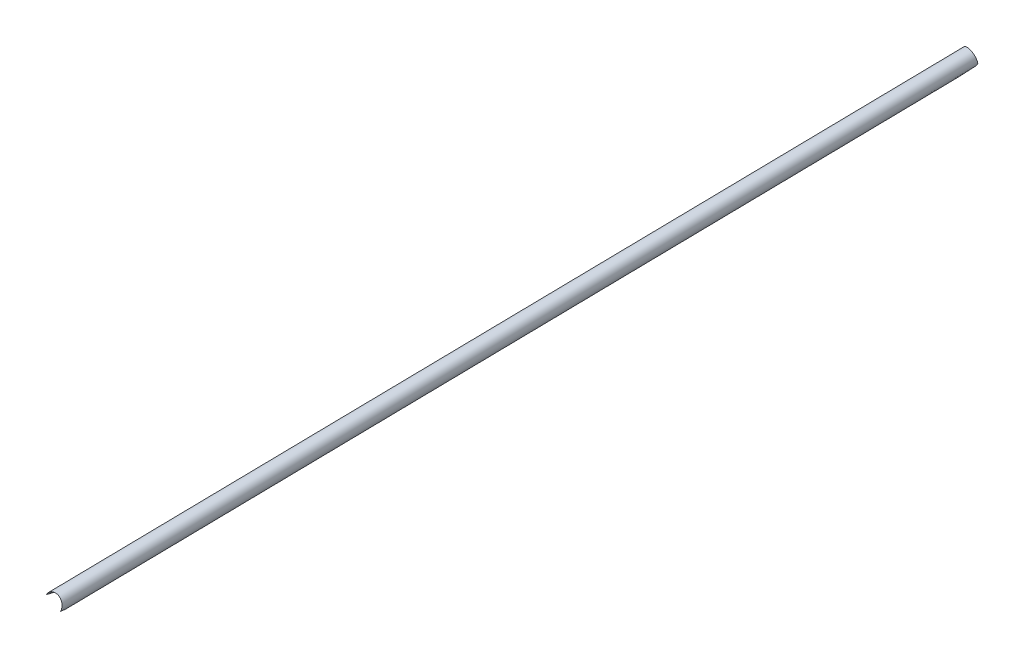
ISO-10303-21;
HEADER;
FILE_DESCRIPTION(('STEP AP214'),'2;1');
FILE_NAME('part.step','',(''),(''),'','','');
FILE_SCHEMA(('AUTOMOTIVE_DESIGN { 1 0 10303 214 1 1 1 1 }'));
ENDSEC;
DATA;
#1=APPLICATION_CONTEXT('core data for automotive mechanical design processes');
#2=APPLICATION_PROTOCOL_DEFINITION('international standard','automotive_design',2000,#1);
#3=PRODUCT_CONTEXT('',#1,'mechanical');
#4=PRODUCT('Part','Part','',(#3));
#5=PRODUCT_RELATED_PRODUCT_CATEGORY('part','',(#4));
#6=PRODUCT_DEFINITION_FORMATION('','',#4);
#7=PRODUCT_DEFINITION_CONTEXT('part definition',#1,'design');
#8=PRODUCT_DEFINITION('design','',#6,#7);
#9=PRODUCT_DEFINITION_SHAPE('','',#8);
#10=(LENGTH_UNIT() NAMED_UNIT(*) SI_UNIT(.MILLI.,.METRE.));
#11=(NAMED_UNIT(*) PLANE_ANGLE_UNIT() SI_UNIT($,.RADIAN.));
#12=(NAMED_UNIT(*) SI_UNIT($,.STERADIAN.) SOLID_ANGLE_UNIT());
#13=UNCERTAINTY_MEASURE_WITH_UNIT(LENGTH_MEASURE(1.E-05),#10,'distance_accuracy_value','');
#14=(GEOMETRIC_REPRESENTATION_CONTEXT(3) GLOBAL_UNCERTAINTY_ASSIGNED_CONTEXT((#13)) GLOBAL_UNIT_ASSIGNED_CONTEXT((#10,
#11,#12)) REPRESENTATION_CONTEXT('',''));
#15=CARTESIAN_POINT('',(0.,0.,0.));
#16=DIRECTION('',(0.,0.,1.));
#17=DIRECTION('',(1.,0.,0.));
#18=AXIS2_PLACEMENT_3D('',#15,#16,#17);
#19=CARTESIAN_POINT('',(325.000000000001,320.,-1580.));
#20=DIRECTION('',(-0.0876619818920292,-0.105194378270435,0.99058039537993));
#21=DIRECTION('',(0.,-0.994408591727349,-0.105600912395825));
#22=AXIS2_PLACEMENT_3D('',#19,#20,#21);
#23=CYLINDRICAL_SURFACE('',#22,9.39999999999998);
#24=CARTESIAN_POINT('',(227.490731729438,193.641437313088,-479.137917119167));
#25=CARTESIAN_POINT('',(227.640293598712,193.620829887061,-478.943880453466));
#26=CARTESIAN_POINT('',(227.784230749418,193.604130606577,-478.745098924725));
#27=CARTESIAN_POINT('',(228.062362185384,193.577332069171,-478.340354423965));
#28=CARTESIAN_POINT('',(228.196552315665,193.567235612407,-478.13438844408));
#29=CARTESIAN_POINT('',(228.45656927496,193.55271356251,-477.716653854516));
#30=CARTESIAN_POINT('',(228.582383440522,193.548296379059,-477.504877112932));
#31=CARTESIAN_POINT('',(228.826476328883,193.544437737184,-477.076974424028));
#32=CARTESIAN_POINT('',(228.944754240573,193.544996813437,-476.860848011845));
#33=CARTESIAN_POINT('',(229.175366406883,193.550546205979,-476.423720790084));
#34=CARTESIAN_POINT('',(229.287657087848,193.555565267787,-476.202697444109));
#35=CARTESIAN_POINT('',(229.506182945142,193.569627597137,-475.757813133367));
#36=CARTESIAN_POINT('',(229.612417984254,193.578670955826,-475.53395210444));
#37=CARTESIAN_POINT('',(229.922783087401,193.61126808132,-474.859332415869));
#38=CARTESIAN_POINT('',(230.118803467549,193.640296063772,-474.405093308473));
#39=CARTESIAN_POINT('',(230.507383267334,193.713679891219,-473.45515499325));
#40=CARTESIAN_POINT('',(230.698513476557,193.759044039791,-472.958956974658));
#41=CARTESIAN_POINT('',(231.063543315764,193.863004828068,-471.961557268425));
#42=CARTESIAN_POINT('',(231.237439350937,193.921604220139,-471.460354560773));
#43=CARTESIAN_POINT('',(231.570813086138,194.051506023565,-470.453979654734));
#44=CARTESIAN_POINT('',(231.730268433771,194.122827637244,-469.948802575015));
#45=CARTESIAN_POINT('',(232.03650398143,194.278156563566,-468.936629673633));
#46=CARTESIAN_POINT('',(232.183285430552,194.362162623826,-468.429634036342));
#47=CARTESIAN_POINT('',(232.465341465405,194.543264378551,-467.416886323554));
#48=CARTESIAN_POINT('',(232.600657075127,194.640309888123,-466.911136698944));
#49=CARTESIAN_POINT('',(232.861816791936,194.849295824819,-465.900183099332));
#50=CARTESIAN_POINT('',(232.987659508985,194.961238431278,-465.394979215091));
#51=CARTESIAN_POINT('',(233.230891993547,195.202458947212,-464.387493734268));
#52=CARTESIAN_POINT('',(233.34829461927,195.331709589764,-463.885208812083));
#53=CARTESIAN_POINT('',(233.518953740866,195.541917284445,-463.135206709665));
#54=CARTESIAN_POINT('',(233.574926176393,195.614698638362,-462.885806977513));
#55=CARTESIAN_POINT('',(233.685158654207,195.766501194247,-462.388538612837));
#56=CARTESIAN_POINT('',(233.739418785111,195.845522072558,-462.140669901614));
#57=CARTESIAN_POINT('',(233.855894317865,196.025589534723,-461.602641995656));
#58=CARTESIAN_POINT('',(233.91778881798,196.128043331065,-461.312880473612));
#59=CARTESIAN_POINT('',(234.039321234518,196.344999623676,-460.737317740715));
#60=CARTESIAN_POINT('',(234.098958721842,196.45950439556,-460.451517289412));
#61=CARTESIAN_POINT('',(234.215732696091,196.703070353127,-459.885925236994));
#62=CARTESIAN_POINT('',(234.272871381217,196.832118372382,-459.606128469497));
#63=CARTESIAN_POINT('',(234.384173839858,197.108161781992,-459.054898332936));
#64=CARTESIAN_POINT('',(234.438338708365,197.255150501251,-458.783461901889));
#65=CARTESIAN_POINT('',(234.526032014378,197.521046377801,-458.336775986883));
#66=CARTESIAN_POINT('',(234.560665583861,197.634114866443,-458.15827640111));
#67=CARTESIAN_POINT('',(234.627340977242,197.871816068891,-457.808667169115));
#68=CARTESIAN_POINT('',(234.659383678558,197.996444836755,-457.637555030303));
#69=CARTESIAN_POINT('',(234.719896766437,198.258228154613,-457.30502767246));
#70=CARTESIAN_POINT('',(234.748374223144,198.395356951456,-457.143593603581));
#71=CARTESIAN_POINT('',(234.800556607669,198.683129238901,-456.832392997781));
#72=CARTESIAN_POINT('',(234.824262819885,198.833769076562,-456.682623327528));
#73=CARTESIAN_POINT('',(234.861861648534,199.122099219948,-456.421110078345));
#74=CARTESIAN_POINT('',(234.876734331232,199.257703845078,-456.307208337222));
#75=CARTESIAN_POINT('',(234.901060642102,199.537767721989,-456.090244111705));
#76=CARTESIAN_POINT('',(234.910515350372,199.682225202551,-455.987179470231));
#77=CARTESIAN_POINT('',(234.922991224894,199.979009891018,-455.79266599235));
#78=CARTESIAN_POINT('',(234.926012953282,200.131336410108,-455.70121614166));
#79=CARTESIAN_POINT('',(234.924705443731,200.442490259282,-455.530193961369));
#80=CARTESIAN_POINT('',(234.920375819632,200.601317930438,-455.450622255956));
#81=CARTESIAN_POINT('',(234.903650509874,200.923277632511,-455.303374679898));
#82=CARTESIAN_POINT('',(234.891283716842,201.086392244672,-455.235657297053));
#83=CARTESIAN_POINT('',(234.857980235236,201.415839579486,-455.111084382694));
#84=CARTESIAN_POINT('',(234.837043565465,201.582172295079,-455.054228827349));
#85=CARTESIAN_POINT('',(234.786226197498,201.916765638856,-454.950330630768));
#86=CARTESIAN_POINT('',(234.756333216975,202.085028607396,-454.903301616561));
#87=CARTESIAN_POINT('',(234.687434568666,202.421926276562,-454.818029978656));
#88=CARTESIAN_POINT('',(234.648426923588,202.59056104997,-454.779789265025));
#89=CARTESIAN_POINT('',(234.545193711341,202.988922522808,-454.69829443146));
#90=CARTESIAN_POINT('',(234.47696993788,203.218304380394,-454.658370224728));
#91=CARTESIAN_POINT('',(234.323469605978,203.67306555957,-454.590101440964));
#92=CARTESIAN_POINT('',(234.238187942377,203.89844366086,-454.56176033832));
#93=CARTESIAN_POINT('',(234.050852888064,204.343283526009,-454.514281533365));
#94=CARTESIAN_POINT('',(233.948788083706,204.562741144494,-454.495150129276));
#95=CARTESIAN_POINT('',(233.728417450821,204.993837711648,-454.464143664802));
#96=CARTESIAN_POINT('',(233.610112901072,205.205477274277,-454.452268033472));
#97=CARTESIAN_POINT('',(233.35644828556,205.621752583016,-454.434055005929));
#98=CARTESIAN_POINT('',(233.220913657801,205.826284654908,-454.427780475787));
#99=CARTESIAN_POINT('',(232.934556855242,206.224441532459,-454.419650024778));
#100=CARTESIAN_POINT('',(232.783734535068,206.41806623437,-454.417794145933));
#101=CARTESIAN_POINT('',(232.467658944122,206.793083659449,-454.417426253157));
#102=CARTESIAN_POINT('',(232.302408953892,206.974479146739,-454.41891348097));
#103=CARTESIAN_POINT('',(231.958372236477,207.323905632235,-454.424381382486));
#104=CARTESIAN_POINT('',(231.779585176446,207.491936301621,-454.428362117516));
#105=CARTESIAN_POINT('',(231.395420933635,207.825775057312,-454.438529062218));
#106=CARTESIAN_POINT('',(231.189055575629,207.990443680025,-454.444859895361));
#107=CARTESIAN_POINT('',(230.763230134834,208.301820784232,-454.459032655217));
#108=CARTESIAN_POINT('',(230.543769377169,208.448528338906,-454.466874659855));
#109=CARTESIAN_POINT('',(230.093238606446,208.72291826024,-454.483656524048));
#110=CARTESIAN_POINT('',(229.862166327262,208.850596893748,-454.492596598399));
#111=CARTESIAN_POINT('',(229.390090549244,209.085957520259,-454.51133735678));
#112=CARTESIAN_POINT('',(229.149087194647,209.193639803562,-454.521138028313));
#113=CARTESIAN_POINT('',(228.659271594457,209.388081864833,-454.541520895987));
#114=CARTESIAN_POINT('',(228.410472726195,209.474875480773,-454.552101791397));
#115=CARTESIAN_POINT('',(227.906481251223,209.627172926988,-454.574170126848));
#116=CARTESIAN_POINT('',(227.651288625568,209.692676694178,-454.585657569575));
#117=CARTESIAN_POINT('',(227.136390292679,209.801968542035,-454.609829848747));
#118=CARTESIAN_POINT('',(226.876685241283,209.84575975154,-454.622514512356));
#119=CARTESIAN_POINT('',(226.354604774762,209.911400903251,-454.649573721853));
#120=CARTESIAN_POINT('',(226.092229356844,209.933250822515,-454.663948269508));
#121=CARTESIAN_POINT('',(225.566451508023,209.954957175997,-454.695119084526));
#122=CARTESIAN_POINT('',(225.303048315877,209.954791743314,-454.711917743115));
#123=CARTESIAN_POINT('',(224.777404202471,209.932527210454,-454.748909851319));
#124=CARTESIAN_POINT('',(224.515163297892,209.910427796489,-454.769103349497));
#125=CARTESIAN_POINT('',(223.993503723949,209.844553926383,-454.814213655069));
#126=CARTESIAN_POINT('',(223.734088780565,209.800753732327,-454.839136049395));
#127=CARTESIAN_POINT('',(223.220438210409,209.69197093002,-454.89538299066));
#128=CARTESIAN_POINT('',(222.966202484147,209.626988729076,-454.926707414489));
#129=CARTESIAN_POINT('',(222.465629748121,209.476773696018,-454.997839048848));
#130=CARTESIAN_POINT('',(222.219275938448,209.391587716229,-455.037626611759));
#131=CARTESIAN_POINT('',(221.736138599239,209.201970411938,-455.128418983689));
#132=CARTESIAN_POINT('',(221.499356544377,209.097536135615,-455.179425513424));
#133=CARTESIAN_POINT('',(221.038660571223,208.871379077578,-455.295711855779));
#134=CARTESIAN_POINT('',(220.814712817465,208.749704997983,-455.36095173055));
#135=CARTESIAN_POINT('',(220.382010615767,208.491276048428,-455.509363602638));
#136=CARTESIAN_POINT('',(220.173246689826,208.354530722655,-455.592524282743));
#137=CARTESIAN_POINT('',(219.838017660626,208.115114202322,-455.750139105084));
#138=CARTESIAN_POINT('',(219.706604431111,208.015552493632,-455.818854952041));
#139=CARTESIAN_POINT('',(219.453234295152,207.812472271733,-455.966998531259));
#140=CARTESIAN_POINT('',(219.331274719705,207.708954887723,-456.046423222669));
#141=CARTESIAN_POINT('',(219.097797699628,207.499663431324,-456.216370363745));
#142=CARTESIAN_POINT('',(218.986266920483,207.39389245906,-456.306878290215));
#143=CARTESIAN_POINT('',(218.774052092625,207.18161572232,-456.499073680751));
#144=CARTESIAN_POINT('',(218.673368411915,207.075109933044,-456.600761523874));
#145=CARTESIAN_POINT('',(218.483251990363,206.863134715392,-456.814586760045));
#146=CARTESIAN_POINT('',(218.393798399835,206.757663711948,-456.926704094951));
#147=CARTESIAN_POINT('',(218.225726679663,206.548853606211,-457.160594179243));
#148=CARTESIAN_POINT('',(218.147108663094,206.445514526176,-457.282367029368));
#149=CARTESIAN_POINT('',(218.000072918888,206.241795865942,-457.534481605152));
#150=CARTESIAN_POINT('',(217.931666095121,206.141419539916,-457.664832279582));
#151=CARTESIAN_POINT('',(217.804341837858,205.944288481748,-457.932680149219));
#152=CARTESIAN_POINT('',(217.745425435079,205.847534143851,-458.070178118523));
#153=CARTESIAN_POINT('',(217.594104397887,205.584937863871,-458.459119952494));
#154=CARTESIAN_POINT('',(217.510787927952,205.42318394973,-458.716877697901));
#155=CARTESIAN_POINT('',(217.365705063926,205.111240416516,-459.245145581561));
#156=CARTESIAN_POINT('',(217.303958144612,204.961061343007,-459.515666995105));
#157=CARTESIAN_POINT('',(217.197441560126,204.670087376912,-460.066508098502));
#158=CARTESIAN_POINT('',(217.152750685185,204.529338454144,-460.346866880993));
#159=CARTESIAN_POINT('',(217.096238081193,204.324520749449,-460.771678167587));
#160=CARTESIAN_POINT('',(217.079156325838,204.257309031846,-460.913971785998));
#161=CARTESIAN_POINT('',(217.048170344829,204.124754744968,-461.199773997149));
#162=CARTESIAN_POINT('',(217.034266124396,204.059412178763,-461.343282591884));
#163=CARTESIAN_POINT('',(217.000654418544,203.885425568161,-461.731677336157));
#164=CARTESIAN_POINT('',(216.983657646216,203.778347192154,-461.977500109377));
#165=CARTESIAN_POINT('',(216.956843462392,203.568101484851,-462.471216095445));
#166=CARTESIAN_POINT('',(216.947026980638,203.464934661682,-462.719109572217));
#167=CARTESIAN_POINT('',(216.933733011829,203.26172702807,-463.216467326906));
#168=CARTESIAN_POINT('',(216.930258396093,203.161687653735,-463.465932265047));
#169=CARTESIAN_POINT('',(216.929032056478,202.964150588993,-463.965885659166));
#170=CARTESIAN_POINT('',(216.931280641273,202.866653035963,-464.216374169623));
#171=CARTESIAN_POINT('',(216.945898055207,202.576729693369,-464.969926549942));
#172=CARTESIAN_POINT('',(216.966162710051,202.387305823973,-465.474003235266));
#173=CARTESIAN_POINT('',(217.025337509762,202.0131270079,-466.482597302118));
#174=CARTESIAN_POINT('',(217.064243042117,201.828370918123,-466.987114543825));
#175=CARTESIAN_POINT('',(217.159923234316,201.460170102385,-467.997453438764));
#176=CARTESIAN_POINT('',(217.216775373796,201.276734657819,-468.5032711337));
#177=CARTESIAN_POINT('',(217.348231804309,200.909973444018,-469.512700010769));
#178=CARTESIAN_POINT('',(217.422837919865,200.726647687998,-470.0163109607));
#179=CARTESIAN_POINT('',(217.590390460105,200.358762715457,-471.018973464189));
#180=CARTESIAN_POINT('',(217.68330350163,200.174206326263,-471.518031611955));
#181=CARTESIAN_POINT('',(217.889075170989,199.80200305538,-472.510823685148));
#182=CARTESIAN_POINT('',(218.001930570483,199.61435667836,-473.004558458636));
#183=CARTESIAN_POINT('',(218.190924252273,199.325025736472,-473.750793109331));
#184=CARTESIAN_POINT('',(218.258900442871,199.225030124361,-474.006028622246));
#185=CARTESIAN_POINT('',(218.401511455034,199.023525012269,-474.514024184231));
#186=CARTESIAN_POINT('',(218.476145923796,198.922015592738,-474.766784363675));
#187=CARTESIAN_POINT('',(218.632778743142,198.717101923983,-475.269630837674));
#188=CARTESIAN_POINT('',(218.714785890034,198.613695531718,-475.519713528919));
#189=CARTESIAN_POINT('',(218.886849940572,198.404831267639,-476.01623066591));
#190=CARTESIAN_POINT('',(218.976906594908,198.29937345944,-476.26266522437));
#191=CARTESIAN_POINT('',(219.165319233759,198.0868915981,-476.749212054149));
#192=CARTESIAN_POINT('',(219.263608265587,197.979885107123,-476.9893577829));
#193=CARTESIAN_POINT('',(219.470247671903,197.763190276729,-477.46413568226));
#194=CARTESIAN_POINT('',(219.578599771082,197.65350147998,-477.698766899078));
#195=CARTESIAN_POINT('',(219.806610908897,197.431307000617,-478.160471987212));
#196=CARTESIAN_POINT('',(219.92624778546,197.318807145511,-478.387559533957));
#197=CARTESIAN_POINT('',(220.178823856613,197.090440740916,-478.832387255258));
#198=CARTESIAN_POINT('',(220.311756204167,196.974575945933,-479.050132159457));
#199=CARTESIAN_POINT('',(220.545186614919,196.779343939104,-479.400796250959));
#200=CARTESIAN_POINT('',(220.641236983241,196.701040658789,-479.53726637236));
#201=CARTESIAN_POINT('',(220.840989942741,196.542700552039,-479.803531413004));
#202=CARTESIAN_POINT('',(220.944694041567,196.462663386265,-479.9333250085));
#203=CARTESIAN_POINT('',(221.16050481208,196.300952242368,-480.184350135378));
#204=CARTESIAN_POINT('',(221.272600261802,196.219280553618,-480.30559269504));
#205=CARTESIAN_POINT('',(221.506200502481,196.054338333734,-480.537372389943));
#206=CARTESIAN_POINT('',(221.627700401169,195.97106865062,-480.647915024901));
#207=CARTESIAN_POINT('',(221.915001995918,195.780678110644,-480.883221837935));
#208=CARTESIAN_POINT('',(222.083962565547,195.673133311002,-481.003885081136));
#209=CARTESIAN_POINT('',(222.439418824721,195.457388587232,-481.215251424777));
#210=CARTESIAN_POINT('',(222.625887730713,195.349189893227,-481.305999359145));
#211=CARTESIAN_POINT('',(222.979739199945,195.154418882775,-481.435237347636));
#212=CARTESIAN_POINT('',(223.144505600999,195.067463104227,-481.480197702502));
#213=CARTESIAN_POINT('',(223.481561931253,194.89773218445,-481.538853213283));
#214=CARTESIAN_POINT('',(223.653843530638,194.814952623364,-481.55258213152));
#215=CARTESIAN_POINT('',(224.001435280082,194.656144415123,-481.546688177054));
#216=CARTESIAN_POINT('',(224.176751476448,194.5801317075,-481.526988641977));
#217=CARTESIAN_POINT('',(224.52461361799,194.437161014469,-481.455780405886));
#218=CARTESIAN_POINT('',(224.697156747903,194.370211774618,-481.404241245037));
#219=CARTESIAN_POINT('',(225.08030952297,194.229700994407,-481.256536795954));
#220=CARTESIAN_POINT('',(225.288801835023,194.159136291656,-481.152136636551));
#221=CARTESIAN_POINT('',(225.690860971903,194.032969620614,-480.910701084105));
#222=CARTESIAN_POINT('',(225.884394308435,193.977400567757,-480.773595123913));
#223=CARTESIAN_POINT('',(226.202844974972,193.893249977561,-480.518807532868));
#224=CARTESIAN_POINT('',(226.331566288014,193.861494192274,-480.406771154704));
#225=CARTESIAN_POINT('',(226.581676709313,193.80375333096,-480.173346615839));
#226=CARTESIAN_POINT('',(226.703062857864,193.777770573153,-480.051954724592));
#227=CARTESIAN_POINT('',(226.939081117166,193.730850400975,-479.801770725336));
#228=CARTESIAN_POINT('',(227.053709076077,193.709916064154,-479.67297416233));
#229=CARTESIAN_POINT('',(227.276735983705,193.672484606421,-479.409545324015));
#230=CARTESIAN_POINT('',(227.385135777667,193.655986882276,-479.274913844954));
#231=CARTESIAN_POINT('',(227.490731729438,193.641437313088,-479.137917119167));
#232=B_SPLINE_CURVE_WITH_KNOTS('',3,(#24,#25,#26,#27,#28,#29,#30,#31,#32,#33,#34,#35,#36,#37,
#38,#39,#40,#41,#42,#43,#44,#45,#46,#47,#48,#49,#50,#51,#52,#53,#54,#55,#56,#57,#58,#59,#60,#61,
#62,#63,#64,#65,#66,#67,#68,#69,#70,#71,#72,#73,#74,#75,#76,#77,#78,#79,#80,#81,#82,#83,#84,#85,
#86,#87,#88,#89,#90,#91,#92,#93,#94,#95,#96,#97,#98,#99,#100,#101,#102,#103,#104,#105,#106,#107,
#108,#109,#110,#111,#112,#113,#114,#115,#116,#117,#118,#119,#120,#121,#122,#123,#124,#125,#126,
#127,#128,#129,#130,#131,#132,#133,#134,#135,#136,#137,#138,#139,#140,#141,#142,#143,#144,#145,
#146,#147,#148,#149,#150,#151,#152,#153,#154,#155,#156,#157,#158,#159,#160,#161,#162,#163,#164,
#165,#166,#167,#168,#169,#170,#171,#172,#173,#174,#175,#176,#177,#178,#179,#180,#181,#182,#183,
#184,#185,#186,#187,#188,#189,#190,#191,#192,#193,#194,#195,#196,#197,#198,#199,#200,#201,#202,
#203,#204,#205,#206,#207,#208,#209,#210,#211,#212,#213,#214,#215,#216,#217,#218,#219,#220,#221,
#222,#223,#224,#225,#226,#227,#228,#229,#230,#231),.UNSPECIFIED.,.T.,.F.,(4,2,2,2,2,2,2,2,2,2,2,
2,2,2,2,2,2,2,2,2,2,2,2,2,2,2,2,2,2,2,2,2,2,2,2,2,2,2,2,2,2,2,2,2,2,2,2,2,2,2,2,2,2,2,2,2,2,2,2,
2,2,2,2,2,2,2,2,2,2,2,2,2,2,2,2,2,2,2,2,2,2,2,2,2,2,2,2,2,2,2,2,2,2,2,2,2,2,2,2,2,2,2,2,4),(0.,
0.737467424947678,1.47524739620147,2.21411859436366,2.95306918172357,3.69681728186733,
4.44058222817223,5.92661413223024,7.52709308611521,9.12790517828252,10.7311542270492,
12.334245084296,13.9313339990426,15.5286568132556,17.1234921911821,17.9207162140895,
18.7178989104573,19.6582172495661,20.5987134710059,21.5383649719664,22.477668130003,
23.1196486966464,23.7614109328899,24.4018796400309,25.0421757045467,25.5747399643936,
26.1071980180812,26.6396095419075,27.1720490337294,27.7025849806486,28.2331197635352,
28.7643854568272,29.2957665075624,30.0226070042383,30.7496653592458,31.4772202226353,
32.2047178284845,32.9402816877734,33.6758525423831,34.4112565774053,35.1466787002156,
35.9379929607981,36.7293480372901,37.520858160514,38.3123567919869,39.10256449623,
39.8927745420369,40.6828706834235,41.4729676509787,42.2638493937024,43.0547424509935,
43.8465757898714,44.6383939035519,45.4283934512684,46.2185142502396,47.0064458995928,
47.7938814108169,48.3291831262599,48.8643331579663,49.398789299178,49.9332635668852,
50.466730379237,51.0002027580744,51.5342407836743,52.0683367700085,53.0131502487257,
53.9588145917328,54.9087960168984,55.3836399267314,55.8584846167636,56.6643237967672,
57.4702673026729,58.2765756140633,59.0829274137129,60.6991024283982,62.3148777419149,
63.937726393753,65.5607418928862,67.1808247239246,68.8006455299872,69.6478510738003,
70.495011753246,71.3431969407054,72.1913558671278,73.0331850751668,73.87515883004,
74.7155121658305,75.5554349347336,76.1082201651963,76.6611145766013,77.2132823617427,
77.7651648108273,78.464616594953,79.1630152972062,79.7355553634241,80.3074761982362,
80.8807104078703,81.4544938612787,82.1812720925942,82.9096328595925,83.4298567108799,
83.9502890874683,84.4710379256239,84.9917159234053),.UNSPECIFIED.);
#233=CARTESIAN_POINT('',(227.490731729438,193.641437313088,-479.137917119167));
#234=VERTEX_POINT('',#233);
#235=EDGE_CURVE('E100',#234,#234,#232,.T.);
#236=ORIENTED_EDGE('',*,*,#235,.T.);
#237=EDGE_LOOP('',(#236));
#238=FACE_BOUND('',#237,.T.);
#239=CARTESIAN_POINT('',(319.788601415888,304.398880936827,-1522.10384457605));
#240=CARTESIAN_POINT('',(319.654750200034,304.372678252061,-1521.8570984417));
#241=CARTESIAN_POINT('',(319.517392457196,304.348637658168,-1521.61201739269));
#242=CARTESIAN_POINT('',(319.234049632278,304.305930372529,-1521.12621432948));
#243=CARTESIAN_POINT('',(319.088060568193,304.287266184841,-1520.88549439522));
#244=CARTESIAN_POINT('',(318.78497658605,304.256862705579,-1520.40980646047));
#245=CARTESIAN_POINT('',(318.627854922965,304.245140770416,-1520.17485427249));
#246=CARTESIAN_POINT('',(318.299763711253,304.231147835867,-1519.71461250432));
#247=CARTESIAN_POINT('',(318.128809033166,304.228866821532,-1519.4893129359));
#248=CARTESIAN_POINT('',(317.857140445703,304.235752422321,-1519.16185707995));
#249=CARTESIAN_POINT('',(317.763412902012,304.239823709046,-1519.05381516231));
#250=CARTESIAN_POINT('',(317.570256033199,304.252366625402,-1518.84326196021));
#251=CARTESIAN_POINT('',(317.47082995268,304.260835772713,-1518.74074759178));
#252=CARTESIAN_POINT('',(317.265905925839,304.283263283367,-1518.5439741693));
#253=CARTESIAN_POINT('',(317.160453639854,304.297184098954,-1518.44966392826));
#254=CARTESIAN_POINT('',(316.941937433278,304.332083329523,-1518.2719339894));
#255=CARTESIAN_POINT('',(316.828889386409,304.353047371235,-1518.18849258872));
#256=CARTESIAN_POINT('',(316.623074793891,304.397853172565,-1518.05601648766));
#257=CARTESIAN_POINT('',(316.532116313233,304.419734775403,-1518.0035591185));
#258=CARTESIAN_POINT('',(316.345593145876,304.469703017761,-1517.91092261108));
#259=CARTESIAN_POINT('',(316.250028612859,304.497789450367,-1517.87074306351));
#260=CARTESIAN_POINT('',(316.054378528932,304.561308790776,-1517.80612667964));
#261=CARTESIAN_POINT('',(315.95425102828,304.596830299183,-1517.78189582786));
#262=CARTESIAN_POINT('',(315.753886578765,304.674823901554,-1517.75368009086));
#263=CARTESIAN_POINT('',(315.653650148567,304.717283410921,-1517.74965895974));
#264=CARTESIAN_POINT('',(315.468818945919,304.802340851708,-1517.76208566695));
#265=CARTESIAN_POINT('',(315.383774988859,304.844330180572,-1517.77617211639));
#266=CARTESIAN_POINT('',(315.219101767897,304.931084874586,-1517.81943109812));
#267=CARTESIAN_POINT('',(315.139478642801,304.975853280752,-1517.8486204223));
#268=CARTESIAN_POINT('',(314.959658515977,305.082957444228,-1517.93213225253));
#269=CARTESIAN_POINT('',(314.862272651249,305.145855832744,-1517.99170811347));
#270=CARTESIAN_POINT('',(314.67968802398,305.271848920331,-1518.12704320688));
#271=CARTESIAN_POINT('',(314.594519906598,305.334943721012,-1518.20284198468));
#272=CARTESIAN_POINT('',(314.441342920701,305.455141845895,-1518.35884377366));
#273=CARTESIAN_POINT('',(314.372503507759,305.512317222913,-1518.43819552437));
#274=CARTESIAN_POINT('',(314.242387688937,305.625659822018,-1518.60360710113));
#275=CARTESIAN_POINT('',(314.181118343935,305.681826061744,-1518.68967306953));
#276=CARTESIAN_POINT('',(314.0648150536,305.793175162595,-1518.86687789428));
#277=CARTESIAN_POINT('',(314.009797596383,305.848355114108,-1518.95802926081));
#278=CARTESIAN_POINT('',(313.905182004228,305.957591292281,-1519.14394293101));
#279=CARTESIAN_POINT('',(313.855581627328,306.011647976269,-1519.23870371879));
#280=CARTESIAN_POINT('',(313.728985164982,306.154884999437,-1519.49592738576));
#281=CARTESIAN_POINT('',(313.65609379096,306.24314648425,-1519.66091738052));
#282=CARTESIAN_POINT('',(313.520183921004,306.417215067733,-1519.99621757065));
#283=CARTESIAN_POINT('',(313.457171425767,306.503020648955,-1520.16653092485));
#284=CARTESIAN_POINT('',(313.338971681106,306.672656423211,-1520.51124598723));
#285=CARTESIAN_POINT('',(313.283800023483,306.756482411345,-1520.68565505951));
#286=CARTESIAN_POINT('',(313.179987392779,306.922289568094,-1521.03727637727));
#287=CARTESIAN_POINT('',(313.131347208734,307.004270512825,-1521.21448895854));
#288=CARTESIAN_POINT('',(313.039320308858,307.167015928267,-1521.57191000915));
#289=CARTESIAN_POINT('',(312.995960203709,307.247772575171,-1521.75212883721));
#290=CARTESIAN_POINT('',(312.913949024492,307.407866041784,-1522.11426317321));
#291=CARTESIAN_POINT('',(312.875298175994,307.487202793325,-1522.29617876198));
#292=CARTESIAN_POINT('',(312.80212128865,307.644510439981,-1522.66111028896));
#293=CARTESIAN_POINT('',(312.767589597054,307.722483078622,-1522.84412434862));
#294=CARTESIAN_POINT('',(312.702093423755,307.877307961149,-1523.21124930117));
#295=CARTESIAN_POINT('',(312.671128832696,307.954160239318,-1523.39536016025));
#296=CARTESIAN_POINT('',(312.572789557345,308.209603897913,-1524.01282122019));
#297=CARTESIAN_POINT('',(312.512479706001,308.385960345922,-1524.44822862277));
#298=CARTESIAN_POINT('',(312.40530699976,308.734356397471,-1525.32243738248));
#299=CARTESIAN_POINT('',(312.358446430852,308.906395262616,-1525.76123930359));
#300=CARTESIAN_POINT('',(312.275660653567,309.247026504486,-1526.64146519693));
#301=CARTESIAN_POINT('',(312.239741323302,309.415616983378,-1527.08289044917));
#302=CARTESIAN_POINT('',(312.177083337037,309.749862202942,-1527.96750350821));
#303=CARTESIAN_POINT('',(312.150344994509,309.915516843191,-1528.41069137467));
#304=CARTESIAN_POINT('',(312.104682251225,310.244769114422,-1529.29951207679));
#305=CARTESIAN_POINT('',(312.085777919729,310.408360433866,-1529.74514826457));
#306=CARTESIAN_POINT('',(312.054890528414,310.73342731074,-1530.63743049801));
#307=CARTESIAN_POINT('',(312.042907563797,310.894902839037,-1531.08407655746));
#308=CARTESIAN_POINT('',(312.016146778096,311.376523056515,-1532.42486909009));
#309=CARTESIAN_POINT('',(312.010542691391,311.693972883327,-1533.32017249123));
#310=CARTESIAN_POINT('',(312.019427577027,312.32485390956,-1535.11604515945));
#311=CARTESIAN_POINT('',(312.033996515657,312.638264116486,-1536.01662121126));
#312=CARTESIAN_POINT('',(312.080570270408,313.261327224616,-1537.81868966579));
#313=CARTESIAN_POINT('',(312.112576456451,313.570979828657,-1538.72018213495));
#314=CARTESIAN_POINT('',(312.192106763775,314.187244273148,-1540.52156199121));
#315=CARTESIAN_POINT('',(312.239600783074,314.493860832757,-1541.42144911417));
#316=CARTESIAN_POINT('',(312.349008567375,315.105927617936,-1543.2207027442));
#317=CARTESIAN_POINT('',(312.410921812119,315.411377885183,-1544.12006926888));
#318=CARTESIAN_POINT('',(312.548402786635,316.02140535373,-1545.91452095696));
#319=CARTESIAN_POINT('',(312.623921928072,316.325981865472,-1546.80961008227));
#320=CARTESIAN_POINT('',(312.788811035242,316.936883060756,-1548.5979741703));
#321=CARTESIAN_POINT('',(312.878181763692,317.243207839668,-1549.49124903038));
#322=CARTESIAN_POINT('',(313.071753411013,317.860352666896,-1551.27748525277));
#323=CARTESIAN_POINT('',(313.175995386398,318.171182945435,-1552.17043864747));
#324=CARTESIAN_POINT('',(313.400688638384,318.798932882749,-1553.95202729049));
#325=CARTESIAN_POINT('',(313.521137256743,319.115851535605,-1554.84066322225));
#326=CARTESIAN_POINT('',(313.715625241153,319.596859072503,-1556.16450596047));
#327=CARTESIAN_POINT('',(313.782389626931,319.757317605424,-1556.60210406911));
#328=CARTESIAN_POINT('',(313.92123009517,320.081158863811,-1557.47536797159));
#329=CARTESIAN_POINT('',(313.993306078337,320.244541534571,-1557.91103380139));
#330=CARTESIAN_POINT('',(314.143567779428,320.57501116188,-1558.78027686967));
#331=CARTESIAN_POINT('',(314.221757882519,320.742100714401,-1559.21385236788));
#332=CARTESIAN_POINT('',(314.385209669126,321.080673502287,-1560.07794143599));
#333=CARTESIAN_POINT('',(314.470471155918,321.252156615333,-1560.50845509071));
#334=CARTESIAN_POINT('',(314.64903872846,321.599735694867,-1561.36366562815));
#335=CARTESIAN_POINT('',(314.742307774869,321.775808050147,-1561.78837976818));
#336=CARTESIAN_POINT('',(314.939068356755,322.134484472812,-1562.63275511959));
#337=CARTESIAN_POINT('',(315.042561258466,322.317089411071,-1563.05241564722));
#338=CARTESIAN_POINT('',(315.262170784652,322.689953987823,-1563.88431816426));
#339=CARTESIAN_POINT('',(315.378270752011,322.880203321594,-1564.29656912356));
#340=CARTESIAN_POINT('',(315.626718943666,323.270119011183,-1565.11155883032));
#341=CARTESIAN_POINT('',(315.759060949661,323.46978174514,-1565.51430114819));
#342=CARTESIAN_POINT('',(315.95310596789,323.748221401509,-1566.05180236896));
#343=CARTESIAN_POINT('',(316.005535179269,323.822207564906,-1566.1924164206));
#344=CARTESIAN_POINT('',(316.113414411326,323.97165213451,-1566.47170613258));
#345=CARTESIAN_POINT('',(316.168864590081,324.047110617625,-1566.61038169101));
#346=CARTESIAN_POINT('',(316.283115455482,324.199570896447,-1566.88556552857));
#347=CARTESIAN_POINT('',(316.341917327737,324.276573231945,-1567.02207301866));
#348=CARTESIAN_POINT('',(316.463205234606,324.432115908633,-1567.29254415096));
#349=CARTESIAN_POINT('',(316.525691225596,324.510656231604,-1567.42650782326));
#350=CARTESIAN_POINT('',(316.718938778455,324.748218539444,-1567.82342676783));
#351=CARTESIAN_POINT('',(316.855773046042,324.909564525167,-1568.08210425666));
#352=CARTESIAN_POINT('',(317.149026247753,325.237852735865,-1568.58438345158));
#353=CARTESIAN_POINT('',(317.305437408595,325.404792720504,-1568.82799108432));
#354=CARTESIAN_POINT('',(317.593699501822,325.694471409022,-1569.22926849919));
#355=CARTESIAN_POINT('',(317.719883883245,325.816277959532,-1569.39167485923));
#356=CARTESIAN_POINT('',(317.985389350144,326.060656860231,-1569.70479353886));
#357=CARTESIAN_POINT('',(318.124708848432,326.18322911623,-1569.85550726733));
#358=CARTESIAN_POINT('',(318.417322901385,326.427333978592,-1570.1433998564));
#359=CARTESIAN_POINT('',(318.570607227733,326.548867275682,-1570.28058847233));
#360=CARTESIAN_POINT('',(318.891677504514,326.7887173704,-1570.54006102035));
#361=CARTESIAN_POINT('',(319.059463180798,326.907034228779,-1570.66234523411));
#362=CARTESIAN_POINT('',(319.410780910448,327.138737584082,-1570.89197528441));
#363=CARTESIAN_POINT('',(319.594431610445,327.252075268263,-1570.99918934867));
#364=CARTESIAN_POINT('',(319.975363715247,327.469873813348,-1571.19719712282));
#365=CARTESIAN_POINT('',(320.172645505169,327.574334423261,-1571.28799036851));
#366=CARTESIAN_POINT('',(320.579433399913,327.77167189088,-1571.45370426707));
#367=CARTESIAN_POINT('',(320.788945830651,327.864542674783,-1571.5286166116));
#368=CARTESIAN_POINT('',(321.218207929647,328.036261991271,-1571.66367527613));
#369=CARTESIAN_POINT('',(321.437957276917,328.115110963148,-1571.72382205874));
#370=CARTESIAN_POINT('',(321.861261729206,328.249210506699,-1571.82511483587));
#371=CARTESIAN_POINT('',(322.063980673741,328.306094566287,-1571.86761553739));
#372=CARTESIAN_POINT('',(322.474410491783,328.406270216761,-1571.94340168478));
#373=CARTESIAN_POINT('',(322.682120875769,328.449563134751,-1571.97668803035));
#374=CARTESIAN_POINT('',(323.10113568356,328.521874360318,-1572.03529878189));
#375=CARTESIAN_POINT('',(323.312440569223,328.550890818961,-1572.06062215644));
#376=CARTESIAN_POINT('',(323.737257110014,328.594195391767,-1572.10447250069));
#377=CARTESIAN_POINT('',(323.95076892182,328.608482452876,-1572.12299898439));
#378=CARTESIAN_POINT('',(324.395822571958,328.622613754678,-1572.15555493644));
#379=CARTESIAN_POINT('',(324.627439607952,328.621210377137,-1572.16910573709));
#380=CARTESIAN_POINT('',(325.09015466345,328.600804763532,-1572.19062894131));
#381=CARTESIAN_POINT('',(325.321252662935,328.581801859957,-1572.19860113327));
#382=CARTESIAN_POINT('',(325.781492553616,328.526246869126,-1572.20988899197));
#383=CARTESIAN_POINT('',(326.01063401198,328.489690996141,-1572.2132036536));
#384=CARTESIAN_POINT('',(326.465490778156,328.399223992587,-1572.21588926456));
#385=CARTESIAN_POINT('',(326.691205947748,328.345312163808,-1572.21526005521));
#386=CARTESIAN_POINT('',(327.153122863238,328.216172161147,-1572.21041620233));
#387=CARTESIAN_POINT('',(327.388985829247,328.139738151813,-1572.20595925207));
#388=CARTESIAN_POINT('',(327.853621714675,327.967932338258,-1572.19352687432));
#389=CARTESIAN_POINT('',(328.082394301429,327.872559647024,-1572.18555128201));
#390=CARTESIAN_POINT('',(328.531326263218,327.663507794178,-1572.16622672836));
#391=CARTESIAN_POINT('',(328.751483902327,327.549824966415,-1572.15487709107));
#392=CARTESIAN_POINT('',(329.181620018206,327.304949586796,-1572.12871199061));
#393=CARTESIAN_POINT('',(329.391598494698,327.173757034465,-1572.11389652734));
#394=CARTESIAN_POINT('',(329.803616416739,326.892246492186,-1572.08015937959));
#395=CARTESIAN_POINT('',(330.0054428335,326.741624811468,-1572.06116810194));
#396=CARTESIAN_POINT('',(330.395532404561,326.424305027215,-1572.0186192059));
#397=CARTESIAN_POINT('',(330.58379525966,326.257606569228,-1571.99506148683));
#398=CARTESIAN_POINT('',(330.945352555398,325.909417771826,-1571.94246856527));
#399=CARTESIAN_POINT('',(331.118644325001,325.727924804059,-1571.91343238829));
#400=CARTESIAN_POINT('',(331.448861334503,325.351713071128,-1571.84868827816));
#401=CARTESIAN_POINT('',(331.605786976055,325.156994630733,-1571.8129805088));
#402=CARTESIAN_POINT('',(331.899229017089,324.759928677632,-1571.7341606954));
#403=CARTESIAN_POINT('',(332.036074619549,324.557794417021,-1571.69120105946));
#404=CARTESIAN_POINT('',(332.291782669862,324.144566433968,-1571.5957933248));
#405=CARTESIAN_POINT('',(332.410645224516,323.933472764745,-1571.54334528244));
#406=CARTESIAN_POINT('',(332.629467644405,323.504949640282,-1571.42723156098));
#407=CARTESIAN_POINT('',(332.729447135213,323.287527037206,-1571.36357766284));
#408=CARTESIAN_POINT('',(332.910183727587,322.84893199016,-1571.22322548444));
#409=CARTESIAN_POINT('',(332.990942879511,322.627759948864,-1571.14652859705));
#410=CARTESIAN_POINT('',(333.127700066478,322.202097231268,-1570.98509066563));
#411=CARTESIAN_POINT('',(333.185139460947,321.997652973512,-1570.9014458818));
#412=CARTESIAN_POINT('',(333.284165420381,321.590814607742,-1570.72088228692));
#413=CARTESIAN_POINT('',(333.325753677568,321.38842028313,-1570.62396489432));
#414=CARTESIAN_POINT('',(333.393994794001,320.988290668342,-1570.41656560231));
#415=CARTESIAN_POINT('',(333.420657200838,320.790552477518,-1570.30609242936));
#416=CARTESIAN_POINT('',(333.46045900201,320.401756859243,-1570.07177425995));
#417=CARTESIAN_POINT('',(333.473596905177,320.210700170714,-1569.94792779064));
#418=CARTESIAN_POINT('',(333.489306130642,319.803646860395,-1569.66447047749));
#419=CARTESIAN_POINT('',(333.4895810046,319.589262493469,-1569.50241716391));
#420=CARTESIAN_POINT('',(333.476650352862,319.173612108433,-1569.16281527539));
#421=CARTESIAN_POINT('',(333.46344158498,318.97234925782,-1568.98526298308));
#422=CARTESIAN_POINT('',(333.426349985889,318.582953172436,-1568.61663640269));
#423=CARTESIAN_POINT('',(333.402444626822,318.394848621975,-1568.42553429625));
#424=CARTESIAN_POINT('',(333.34643308219,318.031782386792,-1568.03246537669));
#425=CARTESIAN_POINT('',(333.314327106139,317.856820366442,-1567.83049884126));
#426=CARTESIAN_POINT('',(333.237343943006,317.487472969859,-1567.37916518626));
#427=CARTESIAN_POINT('',(333.191201347613,317.295568023795,-1567.12799327243));
#428=CARTESIAN_POINT('',(333.092703787112,316.926777752001,-1566.61595627039));
#429=CARTESIAN_POINT('',(333.040346068604,316.749899143161,-1566.35508692148));
#430=CARTESIAN_POINT('',(332.931114096109,316.408891903398,-1565.82547736284));
#431=CARTESIAN_POINT('',(332.874232413998,316.244785155132,-1565.55672468549));
#432=CARTESIAN_POINT('',(332.757272856193,315.927779525209,-1565.01345855435));
#433=CARTESIAN_POINT('',(332.697195417534,315.774879117794,-1564.73894589137));
#434=CARTESIAN_POINT('',(332.57420325638,315.477460445586,-1564.18320222663));
#435=CARTESIAN_POINT('',(332.511270048998,315.333016916027,-1563.90193551142));
#436=CARTESIAN_POINT('',(332.383594646533,315.052394769979,-1563.33572179579));
#437=CARTESIAN_POINT('',(332.318852404827,314.916216366789,-1563.05077470061));
#438=CARTESIAN_POINT('',(332.188028272416,314.651086223552,-1562.47823340388));
#439=CARTESIAN_POINT('',(332.121947863767,314.522127026621,-1562.19064230484));
#440=CARTESIAN_POINT('',(331.988652325842,314.270310512713,-1561.61308132616));
#441=CARTESIAN_POINT('',(331.921437232922,314.147453000732,-1561.32311152289));
#442=CARTESIAN_POINT('',(331.779098680899,313.894677759308,-1560.71133140883));
#443=CARTESIAN_POINT('',(331.703872010974,313.765330886636,-1560.38930966768));
#444=CARTESIAN_POINT('',(331.552411042704,313.512179969786,-1559.74332694349));
#445=CARTESIAN_POINT('',(331.47617671566,313.388376083913,-1559.41936590537));
#446=CARTESIAN_POINT('',(331.246096727153,313.02412656207,-1558.44503511475));
#447=CARTESIAN_POINT('',(331.090891902945,312.790874281265,-1557.79229432879));
#448=CARTESIAN_POINT('',(330.777116726324,312.339080829212,-1556.48219290746));
#449=CARTESIAN_POINT('',(330.618544664343,312.120547377632,-1555.82483004447));
#450=CARTESIAN_POINT('',(330.298087979638,311.695366167926,-1554.50706323383));
#451=CARTESIAN_POINT('',(330.136203258166,311.488718764813,-1553.84665919598));
#452=CARTESIAN_POINT('',(329.808572602108,311.084762103735,-1552.52217410257));
#453=CARTESIAN_POINT('',(329.642818486926,310.887475934125,-1551.85808805296));
#454=CARTESIAN_POINT('',(329.307549467828,310.501277558222,-1550.52842600071));
#455=CARTESIAN_POINT('',(329.138034511081,310.312365469677,-1549.86284997724));
#456=CARTESIAN_POINT('',(328.794976625744,309.941926332296,-1548.53094181551));
#457=CARTESIAN_POINT('',(328.621435078452,309.760396808065,-1547.86461000899));
#458=CARTESIAN_POINT('',(328.269888484521,309.403914736694,-1546.53136992516));
#459=CARTESIAN_POINT('',(328.091883461288,309.228962155079,-1545.8644616509));
#460=CARTESIAN_POINT('',(327.731473476202,308.885607286107,-1544.53226301952));
#461=CARTESIAN_POINT('',(327.549082139032,308.717188123281,-1543.8669733254));
#462=CARTESIAN_POINT('',(327.178922897947,308.386076046784,-1542.53646195097));
#463=CARTESIAN_POINT('',(326.991154980385,308.22338314765,-1541.87124027085));
#464=CARTESIAN_POINT('',(326.609621977631,307.903544886522,-1540.54104314752));
#465=CARTESIAN_POINT('',(326.415855804798,307.746400541815,-1539.87606777137));
#466=CARTESIAN_POINT('',(326.021661179847,307.437691357204,-1538.5467976156));
#467=CARTESIAN_POINT('',(325.82123275962,307.286126490599,-1537.88250283275));
#468=CARTESIAN_POINT('',(325.413229695168,306.988996146384,-1536.55612939857));
#469=CARTESIAN_POINT('',(325.205668544567,306.843420374093,-1535.8940489101));
#470=CARTESIAN_POINT('',(324.782009964283,306.558304983985,-1534.57132257958));
#471=CARTESIAN_POINT('',(324.565912637858,306.418765293195,-1533.91067672027));
#472=CARTESIAN_POINT('',(324.123877827599,306.146286520892,-1532.59147397992));
#473=CARTESIAN_POINT('',(323.897942449924,306.013346039516,-1531.93291668382));
#474=CARTESIAN_POINT('',(323.43443005425,305.754854721359,-1530.6184698275));
#475=CARTESIAN_POINT('',(323.196853713726,305.629303455478,-1529.96258011443));
#476=CARTESIAN_POINT('',(322.837754525904,305.451357927521,-1529.00250240331));
#477=CARTESIAN_POINT('',(322.721743746207,305.395583782841,-1528.69687382726));
#478=CARTESIAN_POINT('',(322.486291099844,305.286111927399,-1528.08656330359));
#479=CARTESIAN_POINT('',(322.36684921952,305.232414224904,-1527.78188135974));
#480=CARTESIAN_POINT('',(322.12409149069,305.127288526081,-1527.17350698618));
#481=CARTESIAN_POINT('',(322.000773932877,305.075861555969,-1526.86981506015));
#482=CARTESIAN_POINT('',(321.749836080982,304.975577447085,-1526.26378663765));
#483=CARTESIAN_POINT('',(321.622215821719,304.926720287524,-1525.96145013022));
#484=CARTESIAN_POINT('',(321.362275813451,304.831996629204,-1525.35888795941));
#485=CARTESIAN_POINT('',(321.229963559114,304.78612566592,-1525.05865977285));
#486=CARTESIAN_POINT('',(320.959709632134,304.697745020821,-1524.4602514774));
#487=CARTESIAN_POINT('',(320.821768125852,304.655235239782,-1524.16207130829));
#488=CARTESIAN_POINT('',(320.539359498916,304.574199374728,-1523.56846646945));
#489=CARTESIAN_POINT('',(320.394896065642,304.535671079198,-1523.27304035385));
#490=CARTESIAN_POINT('',(320.09809976749,304.463395578432,-1522.68559272571));
#491=CARTESIAN_POINT('',(319.945767844752,304.429647802598,-1522.39357081068));
#492=CARTESIAN_POINT('',(319.788601415888,304.398880936827,-1522.10384457605));
#493=B_SPLINE_CURVE_WITH_KNOTS('',3,(#239,#240,#241,#242,#243,#244,#245,#246,#247,#248,#249,
#250,#251,#252,#253,#254,#255,#256,#257,#258,#259,#260,#261,#262,#263,#264,#265,#266,#267,#268,
#269,#270,#271,#272,#273,#274,#275,#276,#277,#278,#279,#280,#281,#282,#283,#284,#285,#286,#287,
#288,#289,#290,#291,#292,#293,#294,#295,#296,#297,#298,#299,#300,#301,#302,#303,#304,#305,#306,
#307,#308,#309,#310,#311,#312,#313,#314,#315,#316,#317,#318,#319,#320,#321,#322,#323,#324,#325,
#326,#327,#328,#329,#330,#331,#332,#333,#334,#335,#336,#337,#338,#339,#340,#341,#342,#343,#344,
#345,#346,#347,#348,#349,#350,#351,#352,#353,#354,#355,#356,#357,#358,#359,#360,#361,#362,#363,
#364,#365,#366,#367,#368,#369,#370,#371,#372,#373,#374,#375,#376,#377,#378,#379,#380,#381,#382,
#383,#384,#385,#386,#387,#388,#389,#390,#391,#392,#393,#394,#395,#396,#397,#398,#399,#400,#401,
#402,#403,#404,#405,#406,#407,#408,#409,#410,#411,#412,#413,#414,#415,#416,#417,#418,#419,#420,
#421,#422,#423,#424,#425,#426,#427,#428,#429,#430,#431,#432,#433,#434,#435,#436,#437,#438,#439,
#440,#441,#442,#443,#444,#445,#446,#447,#448,#449,#450,#451,#452,#453,#454,#455,#456,#457,#458,
#459,#460,#461,#462,#463,#464,#465,#466,#467,#468,#469,#470,#471,#472,#473,#474,#475,#476,#477,
#478,#479,#480,#481,#482,#483,#484,#485,#486,#487,#488,#489,#490,#491,#492),.UNSPECIFIED.,.T.,
.F.,(4,2,2,2,2,2,2,2,2,2,2,2,2,2,2,2,2,2,2,2,2,2,2,2,2,2,2,2,2,2,2,2,2,2,2,2,2,2,2,2,2,2,2,2,2,
2,2,2,2,2,2,2,2,2,2,2,2,2,2,2,2,2,2,2,2,2,2,2,2,2,2,2,2,2,2,2,2,2,2,2,2,2,2,2,2,2,2,2,2,2,2,2,2,
2,2,2,2,2,2,2,2,2,2,2,2,2,2,2,2,2,2,2,2,2,2,2,2,2,2,2,2,2,2,2,2,2,4),(0.,0.845761040440761,
1.6919153591588,2.54017632479818,3.38753722225136,3.81659221703547,4.24540529980221,
4.67131550183769,5.0963617660217,5.41737680857626,5.73838114785265,6.06345403678934,
6.38794370256934,6.67410966333911,6.96059447926678,7.34941849369833,7.73920133422207,
8.09747718977087,8.45608473921834,8.81561711034093,9.17500011369162,9.77694523284094,
10.3792545848187,10.9827453772456,11.5863090091763,12.1927985778285,12.7993171856513,
13.4049936473652,14.0106515358629,15.4311864679516,16.8519627073464,18.2735009092956,
19.6950876430831,21.120294030837,22.5455200217177,25.3950039963062,28.2558157777332,
31.1168523454556,33.9723610497701,36.8277667407809,39.6731705668853,42.5187311266318,
45.3723054589997,48.2254123121516,49.6379184958845,51.0503982812983,52.4639005844758,
53.8773635776829,55.2846085483205,56.6920418267434,58.0976376508677,59.5026970084989,
60.004613738223,60.5065567566491,61.0086784448192,61.5107941885803,62.5125042981936,
63.5138179189859,64.2303514210716,64.9467984512892,65.6627248864282,66.3786377898136,
67.1004657433559,67.8223140989614,68.5445391741545,69.2667416186314,69.9104410129998,
70.5540775339515,71.1977973899016,71.8415632643527,72.5368594777899,73.232182063379,
73.9276546798007,74.6231552777266,75.3662294720478,76.1093384771758,76.8525964568534,
77.595854456722,78.352591302439,79.1093448360952,79.8662331067494,80.6231027977368,
81.3656925427222,82.1082778772656,82.8500871279708,83.5918172095969,84.2756111166599,
84.9593320033901,85.6426150344402,86.3259733940298,87.1309397571573,87.9360997227314,
88.7429634584455,89.5498065819112,90.5074302631427,91.4654797815313,92.4251362004254,
93.3846617172074,94.351676171976,95.3187155719292,96.2847369296287,97.2507273942547,
98.3159318450639,99.3811666977321,101.511890274156,103.643722798704,105.775618963865,
107.912525602892,110.049462279419,112.185676425511,114.321879372006,116.452136873494,
118.582399782656,120.713051253754,122.843692527264,124.970503783143,127.097289319884,
129.223621765272,131.349830610018,132.344698579874,133.339570510589,134.334887547869,
135.330196532522,136.323981579405,137.317737278398,138.310937994926,139.304020064087),.UNSPECIFIED.);
#494=CARTESIAN_POINT('',(319.788601415888,304.398880936827,-1522.10384457605));
#495=VERTEX_POINT('',#494);
#496=EDGE_CURVE('E92',#495,#495,#493,.T.);
#497=ORIENTED_EDGE('',*,*,#496,.T.);
#498=EDGE_LOOP('',(#497));
#499=FACE_BOUND('',#498,.T.);
#500=ADVANCED_FACE('F41',(#238,#499),#23,.F.);
#501=CARTESIAN_POINT('',(325.000000000001,320.,-1580.));
#502=DIRECTION('',(-0.0876619818920292,-0.105194378270435,0.99058039537993));
#503=DIRECTION('',(0.,-0.994408591727349,-0.105600912395825));
#504=AXIS2_PLACEMENT_3D('',#501,#502,#503);
#505=CYLINDRICAL_SURFACE('',#504,11.);
#506=CARTESIAN_POINT('',(225.,200.,-450.));
#507=DIRECTION('',(-0.410073590459099,-0.89186931574694,0.190810833122936));
#508=DIRECTION('',(0.0454319322245437,0.188975755350688,0.980930223524579));
#509=AXIS2_PLACEMENT_3D('',#506,#507,#508);
#510=ELLIPSE('',#509,34.5064509936078,11.);
#511=CARTESIAN_POINT('',(214.979877925743,204.520147319476,-450.406720822202));
#512=VERTEX_POINT('',#511);
#513=CARTESIAN_POINT('',(235.020122074258,195.479852680524,-449.593279177798));
#514=VERTEX_POINT('',#513);
#515=EDGE_CURVE('E125',#512,#514,#510,.T.);
#516=ORIENTED_EDGE('',*,*,#515,.F.);
#517=CARTESIAN_POINT('',(225.,200.,-450.));
#518=DIRECTION('',(0.0454319322245437,0.188975755350688,0.980930223524579));
#519=DIRECTION('',(-0.410073590459099,-0.89186931574694,0.190810833122936));
#520=AXIS2_PLACEMENT_3D('',#517,#518,#519);
#521=ELLIPSE('',#520,11.6054761633343,11.);
#522=EDGE_CURVE('E91',#514,#512,#521,.T.);
#523=ORIENTED_EDGE('',*,*,#522,.F.);
#524=EDGE_LOOP('',(#516,#523));
#525=FACE_BOUND('',#524,.T.);
#526=CARTESIAN_POINT('',(325.,320.,-1580.));
#527=DIRECTION('',(-0.150058846911564,-0.246494284149993,0.957456479608841));
#528=DIRECTION('',(0.384326361991009,0.877714805823999,0.286199173856417));
#529=AXIS2_PLACEMENT_3D('',#526,#527,#528);
#530=ELLIPSE('',#529,11.1389936208953,11.);
#531=CARTESIAN_POINT('',(315.659557692763,325.814860529643,-1579.9668769473));
#532=VERTEX_POINT('',#531);
#533=CARTESIAN_POINT('',(335.66673865399,317.492670443989,-1578.97374332973));
#534=VERTEX_POINT('',#533);
#535=EDGE_CURVE('E78',#532,#534,#530,.F.);
#536=ORIENTED_EDGE('',*,*,#535,.F.);
#537=CARTESIAN_POINT('',(325.,320.,-1580.));
#538=DIRECTION('',(-0.0427126536783038,-0.0629297921225689,-0.997103540500768));
#539=DIRECTION('',(-0.611440895819701,-0.787641342485716,0.0759022168747455));
#540=AXIS2_PLACEMENT_3D('',#537,#538,#539);
#541=ELLIPSE('',#540,11.2549576190536,11.);
#542=CARTESIAN_POINT('',(314.891903689045,324.374891386655,-1579.84311297152));
#543=VERTEX_POINT('',#542);
#544=EDGE_CURVE('E45',#543,#532,#541,.T.);
#545=ORIENTED_EDGE('',*,*,#544,.F.);
#546=CARTESIAN_POINT('',(325.,320.,-1580.));
#547=DIRECTION('',(0.384326361991009,0.877714805823999,0.286199173856417));
#548=DIRECTION('',(-0.150058846911564,-0.246494284149993,0.957456479608841));
#549=AXIS2_PLACEMENT_3D('',#546,#547,#548);
#550=ELLIPSE('',#549,69.849333819045,11.);
#551=CARTESIAN_POINT('',(334.755235139211,315.051279321346,-1577.9232246896));
#552=VERTEX_POINT('',#551);
#553=EDGE_CURVE('E85',#552,#543,#550,.F.);
#554=ORIENTED_EDGE('',*,*,#553,.F.);
#555=CARTESIAN_POINT('',(325.,320.,-1580.));
#556=DIRECTION('',(0.0809476542255871,0.517144548792442,0.852061613341216));
#557=DIRECTION('',(-0.242541310856887,-0.818950466320631,0.520090228942098));
#558=AXIS2_PLACEMENT_3D('',#555,#556,#557);
#559=ELLIPSE('',#558,14.0568110074798,11.);
#560=CARTESIAN_POINT('',(335.634338905931,317.26363752886,-1579.3494952265));
#561=VERTEX_POINT('',#560);
#562=EDGE_CURVE('E51',#561,#552,#559,.F.);
#563=ORIENTED_EDGE('',*,*,#562,.F.);
#564=CARTESIAN_POINT('',(325.,320.,-1580.));
#565=DIRECTION('',(-0.242541310856887,-0.818950466320631,0.520090228942098));
#566=DIRECTION('',(0.0809476542255871,0.517144548792442,0.852061613341216));
#567=AXIS2_PLACEMENT_3D('',#564,#565,#566);
#568=ELLIPSE('',#567,17.667792826144,11.);
#569=EDGE_CURVE('E11',#534,#561,#568,.F.);
#570=ORIENTED_EDGE('',*,*,#569,.F.);
#571=EDGE_LOOP('',(#536,#545,#554,#563,#570));
#572=FACE_BOUND('',#571,.T.);
#573=ADVANCED_FACE('F87',(#525,#572),#505,.T.);
#574=CARTESIAN_POINT('',(325.,320.,-1580.));
#575=DIRECTION('',(-0.0427126536783038,-0.0629297921225689,-0.997103540500768));
#576=DIRECTION('',(0.,0.998014330188054,-0.0629872744234135));
#577=AXIS2_PLACEMENT_3D('',#574,#575,#576);
#578=PLANE('',#577);
#579=ORIENTED_EDGE('',*,*,#544,.T.);
#580=CARTESIAN_POINT('',(325.,320.,-1580.));
#581=DIRECTION('',(-0.0427126536783038,-0.0629297921225689,-0.997103540500768));
#582=DIRECTION('',(0.489400664257567,0.868759037548237,-0.0757939608577899));
#583=AXIS2_PLACEMENT_3D('',#580,#581,#582);
#584=ELLIPSE('',#583,12.7182524712078,11.);
#585=EDGE_CURVE('E75',#532,#543,#584,.F.);
#586=ORIENTED_EDGE('',*,*,#585,.T.);
#587=EDGE_LOOP('',(#579,#586));
#588=FACE_BOUND('',#587,.T.);
#589=ADVANCED_FACE('F113',(#588),#578,.T.);
#590=CARTESIAN_POINT('',(225.,200.,-450.000000000001));
#591=DIRECTION('',(-0.173785333909048,-0.463427557090794,-0.868926669545238));
#592=DIRECTION('',(0.,0.882352941176471,-0.470588235294118));
#593=AXIS2_PLACEMENT_3D('',#590,#591,#592);
#594=CYLINDRICAL_SURFACE('',#593,11.);
#595=ORIENTED_EDGE('',*,*,#235,.F.);
#596=EDGE_LOOP('',(#595));
#597=FACE_BOUND('',#596,.T.);
#598=ORIENTED_EDGE('',*,*,#515,.T.);
#599=ORIENTED_EDGE('',*,*,#522,.T.);
#600=EDGE_LOOP('',(#598,#599));
#601=FACE_BOUND('',#600,.T.);
#602=ADVANCED_FACE('F110',(#597,#601),#594,.F.);
#603=CARTESIAN_POINT('',(150.,2.22044604925031E-13,-825.));
#604=DIRECTION('',(0.20871080944,0.381642622975999,-0.900438063583998));
#605=DIRECTION('',(0.,0.920714591276893,0.390236647958419));
#606=AXIS2_PLACEMENT_3D('',#603,#604,#605);
#607=CYLINDRICAL_SURFACE('',#606,11.);
#608=ORIENTED_EDGE('',*,*,#496,.F.);
#609=EDGE_LOOP('',(#608));
#610=FACE_BOUND('',#609,.T.);
#611=ORIENTED_EDGE('',*,*,#553,.T.);
#612=ORIENTED_EDGE('',*,*,#585,.F.);
#613=ORIENTED_EDGE('',*,*,#535,.T.);
#614=CARTESIAN_POINT('',(325.,320.,-1580.));
#615=DIRECTION('',(-0.00416950723616232,-0.393939167319851,-0.919127057408686));
#616=DIRECTION('',(0.2871987901008,0.87994037819309,-0.37844654284329));
#617=AXIS2_PLACEMENT_3D('',#614,#615,#616);
#618=ELLIPSE('',#617,16.2624994633842,11.);
#619=EDGE_CURVE('E80',#534,#552,#618,.T.);
#620=ORIENTED_EDGE('',*,*,#619,.T.);
#621=EDGE_LOOP('',(#611,#612,#613,#620));
#622=FACE_BOUND('',#621,.T.);
#623=ADVANCED_FACE('F79',(#610,#622),#607,.F.);
#624=CARTESIAN_POINT('',(325.,320.,-1580.));
#625=DIRECTION('',(-0.214351342090107,-0.914565726251124,-0.342962147344171));
#626=DIRECTION('',(0.,0.351123441588391,-0.936329177569045));
#627=AXIS2_PLACEMENT_3D('',#624,#625,#626);
#628=CYLINDRICAL_SURFACE('',#627,11.);
#629=ORIENTED_EDGE('',*,*,#562,.T.);
#630=ORIENTED_EDGE('',*,*,#619,.F.);
#631=ORIENTED_EDGE('',*,*,#569,.T.);
#632=EDGE_LOOP('',(#629,#630,#631));
#633=FACE_BOUND('',#632,.T.);
#634=ADVANCED_FACE('F43',(#633),#628,.F.);
#635=CLOSED_SHELL('',(#500,#573,#589,#602,#623,#634));
#636=MANIFOLD_SOLID_BREP('B2',#635);
#637=ADVANCED_BREP_SHAPE_REPRESENTATION('',(#18,#636),#14);
#638=SHAPE_DEFINITION_REPRESENTATION(#9,#637);
ENDSEC;
END-ISO-10303-21;
